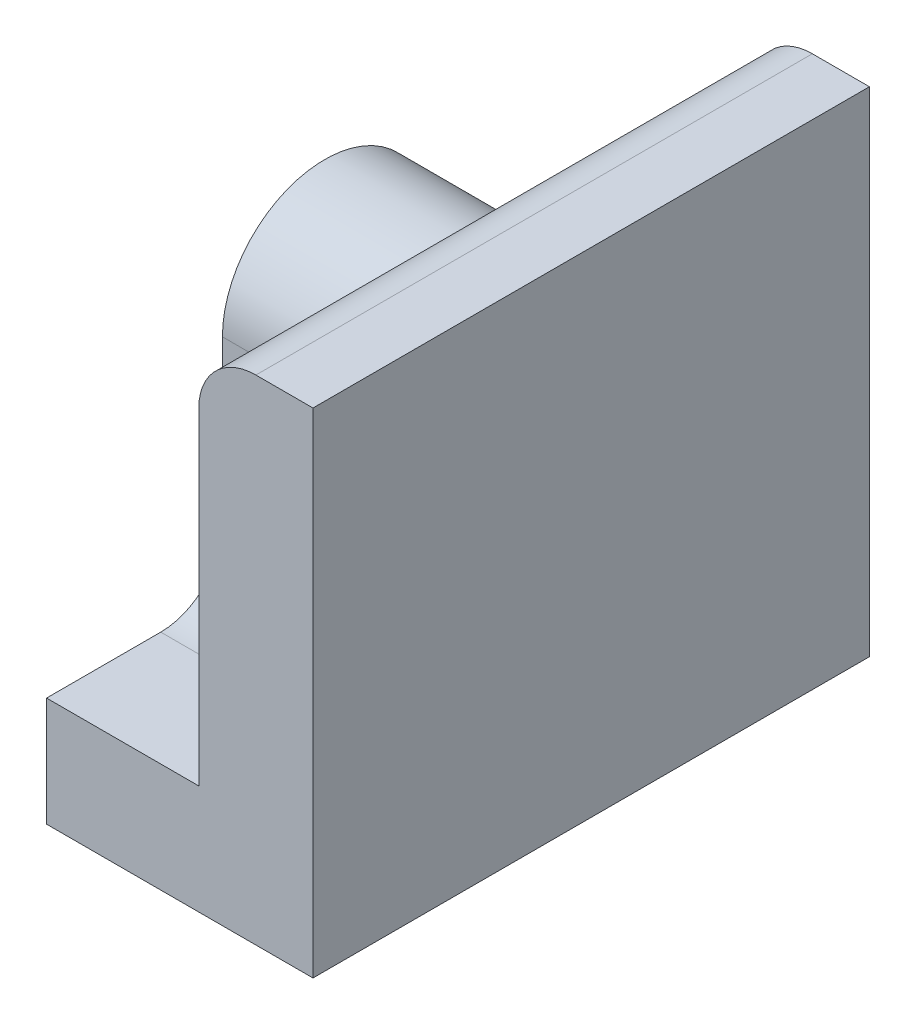
ISO-10303-21;
HEADER;
FILE_DESCRIPTION(('STEP AP214'),'2;1');
FILE_NAME('part.step','',(''),(''),'','','');
FILE_SCHEMA(('AUTOMOTIVE_DESIGN { 1 0 10303 214 1 1 1 1 }'));
ENDSEC;
DATA;
#1=APPLICATION_CONTEXT('core data for automotive mechanical design processes');
#2=APPLICATION_PROTOCOL_DEFINITION('international standard','automotive_design',2000,#1);
#3=PRODUCT_CONTEXT('',#1,'mechanical');
#4=PRODUCT('Part','Part','',(#3));
#5=PRODUCT_RELATED_PRODUCT_CATEGORY('part','',(#4));
#6=PRODUCT_DEFINITION_FORMATION('','',#4);
#7=PRODUCT_DEFINITION_CONTEXT('part definition',#1,'design');
#8=PRODUCT_DEFINITION('design','',#6,#7);
#9=PRODUCT_DEFINITION_SHAPE('','',#8);
#10=(LENGTH_UNIT() NAMED_UNIT(*) SI_UNIT(.MILLI.,.METRE.));
#11=(NAMED_UNIT(*) PLANE_ANGLE_UNIT() SI_UNIT($,.RADIAN.));
#12=(NAMED_UNIT(*) SI_UNIT($,.STERADIAN.) SOLID_ANGLE_UNIT());
#13=UNCERTAINTY_MEASURE_WITH_UNIT(LENGTH_MEASURE(1.E-05),#10,'distance_accuracy_value','');
#14=(GEOMETRIC_REPRESENTATION_CONTEXT(3) GLOBAL_UNCERTAINTY_ASSIGNED_CONTEXT((#13)) GLOBAL_UNIT_ASSIGNED_CONTEXT((#10,
#11,#12)) REPRESENTATION_CONTEXT('',''));
#15=CARTESIAN_POINT('',(0.,0.,0.));
#16=DIRECTION('',(0.,0.,1.));
#17=DIRECTION('',(1.,0.,0.));
#18=AXIS2_PLACEMENT_3D('',#15,#16,#17);
#19=CARTESIAN_POINT('',(-7.,0.,-7.31));
#20=DIRECTION('',(0.,0.,1.));
#21=DIRECTION('',(1.,0.,0.));
#22=AXIS2_PLACEMENT_3D('',#19,#20,#21);
#23=PLANE('',#22);
#24=CARTESIAN_POINT('',(-1.5,8.6,-7.31));
#25=DIRECTION('',(0.,0.,-1.));
#26=DIRECTION('',(-1.,0.,0.));
#27=AXIS2_PLACEMENT_3D('',#24,#25,#26);
#28=CIRCLE('',#27,1.5);
#29=CARTESIAN_POINT('',(-3.,8.6,-7.31));
#30=VERTEX_POINT('',#29);
#31=CARTESIAN_POINT('',(-1.49999999999999,10.1,-7.31));
#32=VERTEX_POINT('',#31);
#33=EDGE_CURVE('E142',#30,#32,#28,.T.);
#34=ORIENTED_EDGE('',*,*,#33,.T.);
#35=DIRECTION('',(1.,0.,0.));
#36=VECTOR('',#35,1.);
#37=CARTESIAN_POINT('',(-3.,10.1,-7.31));
#38=LINE('',#37,#36);
#39=CARTESIAN_POINT('',(0.,10.1,-7.31));
#40=VERTEX_POINT('',#39);
#41=EDGE_CURVE('E150',#32,#40,#38,.T.);
#42=ORIENTED_EDGE('',*,*,#41,.T.);
#43=DIRECTION('',(0.,-1.,0.));
#44=VECTOR('',#43,1.);
#45=CARTESIAN_POINT('',(0.,0.,-7.31));
#46=LINE('',#45,#44);
#47=CARTESIAN_POINT('',(0.,-2.87,-7.31));
#48=VERTEX_POINT('',#47);
#49=EDGE_CURVE('E212',#40,#48,#46,.T.);
#50=ORIENTED_EDGE('',*,*,#49,.T.);
#51=DIRECTION('',(1.,0.,0.));
#52=VECTOR('',#51,1.);
#53=CARTESIAN_POINT('',(-7.,-2.87,-7.31));
#54=LINE('',#53,#52);
#55=CARTESIAN_POINT('',(-7.,-2.87,-7.31));
#56=VERTEX_POINT('',#55);
#57=EDGE_CURVE('E227',#56,#48,#54,.T.);
#58=ORIENTED_EDGE('',*,*,#57,.F.);
#59=DIRECTION('',(0.,-1.,0.));
#60=VECTOR('',#59,1.);
#61=CARTESIAN_POINT('',(-7.,0.,-7.31));
#62=LINE('',#61,#60);
#63=CARTESIAN_POINT('',(-7.,0.,-7.31));
#64=VERTEX_POINT('',#63);
#65=EDGE_CURVE('E219',#64,#56,#62,.T.);
#66=ORIENTED_EDGE('',*,*,#65,.F.);
#67=DIRECTION('',(1.,0.,0.));
#68=VECTOR('',#67,1.);
#69=CARTESIAN_POINT('',(-7.,0.,-7.31));
#70=LINE('',#69,#68);
#71=CARTESIAN_POINT('',(-3.,0.,-7.31));
#72=VERTEX_POINT('',#71);
#73=EDGE_CURVE('E44',#64,#72,#70,.T.);
#74=ORIENTED_EDGE('',*,*,#73,.T.);
#75=DIRECTION('',(0.,1.,0.));
#76=VECTOR('',#75,1.);
#77=CARTESIAN_POINT('',(-3.,0.,-7.31));
#78=LINE('',#77,#76);
#79=EDGE_CURVE('E198',#72,#30,#78,.T.);
#80=ORIENTED_EDGE('',*,*,#79,.T.);
#81=EDGE_LOOP('',(#34,#42,#50,#58,#66,#74,#80));
#82=FACE_BOUND('',#81,.T.);
#83=ADVANCED_FACE('F35',(#82),#23,.F.);
#84=CARTESIAN_POINT('',(-3.,10.1,0.));
#85=DIRECTION('',(0.,-1.,0.));
#86=DIRECTION('',(0.,0.,-1.));
#87=AXIS2_PLACEMENT_3D('',#84,#85,#86);
#88=PLANE('',#87);
#89=DIRECTION('',(0.,0.,-1.));
#90=VECTOR('',#89,1.);
#91=CARTESIAN_POINT('',(-1.49999999999999,10.1,7.311));
#92=LINE('',#91,#90);
#93=CARTESIAN_POINT('',(-1.49999999999999,10.1,7.31));
#94=VERTEX_POINT('',#93);
#95=EDGE_CURVE('E136',#94,#32,#92,.T.);
#96=ORIENTED_EDGE('',*,*,#95,.F.);
#97=DIRECTION('',(1.,0.,0.));
#98=VECTOR('',#97,1.);
#99=CARTESIAN_POINT('',(-3.,10.1,7.31));
#100=LINE('',#99,#98);
#101=CARTESIAN_POINT('',(0.,10.1,7.31));
#102=VERTEX_POINT('',#101);
#103=EDGE_CURVE('E148',#94,#102,#100,.T.);
#104=ORIENTED_EDGE('',*,*,#103,.T.);
#105=DIRECTION('',(0.,0.,-1.));
#106=VECTOR('',#105,1.);
#107=CARTESIAN_POINT('',(0.,10.1,0.));
#108=LINE('',#107,#106);
#109=EDGE_CURVE('E181',#102,#40,#108,.T.);
#110=ORIENTED_EDGE('',*,*,#109,.T.);
#111=ORIENTED_EDGE('',*,*,#41,.F.);
#112=EDGE_LOOP('',(#96,#104,#110,#111));
#113=FACE_BOUND('',#112,.T.);
#114=ADVANCED_FACE('F146',(#113),#88,.F.);
#115=CARTESIAN_POINT('',(-3.,0.,0.));
#116=DIRECTION('',(1.,0.,0.));
#117=DIRECTION('',(0.,0.,-1.));
#118=AXIS2_PLACEMENT_3D('',#115,#116,#117);
#119=PLANE('',#118);
#120=DIRECTION('',(0.,1.,0.));
#121=VECTOR('',#120,1.);
#122=CARTESIAN_POINT('',(-3.,0.,7.31));
#123=LINE('',#122,#121);
#124=CARTESIAN_POINT('',(-3.,0.,7.31));
#125=VERTEX_POINT('',#124);
#126=CARTESIAN_POINT('',(-3.,8.6,7.31));
#127=VERTEX_POINT('',#126);
#128=EDGE_CURVE('E290',#125,#127,#123,.T.);
#129=ORIENTED_EDGE('',*,*,#128,.T.);
#130=DIRECTION('',(0.,0.,-1.));
#131=VECTOR('',#130,1.);
#132=CARTESIAN_POINT('',(-3.,8.6,7.311));
#133=LINE('',#132,#131);
#134=CARTESIAN_POINT('',(-3.,8.6,0.));
#135=VERTEX_POINT('',#134);
#136=EDGE_CURVE('E52',#127,#135,#133,.T.);
#137=ORIENTED_EDGE('',*,*,#136,.T.);
#138=CARTESIAN_POINT('',(-3.,5.91,0.));
#139=DIRECTION('',(1.,0.,0.));
#140=DIRECTION('',(0.,0.,-1.));
#141=AXIS2_PLACEMENT_3D('',#138,#139,#140);
#142=CIRCLE('',#141,2.69);
#143=CARTESIAN_POINT('',(-3.,5.91,2.69));
#144=VERTEX_POINT('',#143);
#145=EDGE_CURVE('E201',#135,#144,#142,.T.);
#146=ORIENTED_EDGE('',*,*,#145,.T.);
#147=DIRECTION('',(0.,1.,0.));
#148=VECTOR('',#147,1.);
#149=CARTESIAN_POINT('',(-3.,0.,2.69));
#150=LINE('',#149,#148);
#151=CARTESIAN_POINT('',(-3.,1.62,2.69));
#152=VERTEX_POINT('',#151);
#153=EDGE_CURVE('E151',#152,#144,#150,.T.);
#154=ORIENTED_EDGE('',*,*,#153,.F.);
#155=CARTESIAN_POINT('',(-3.,1.62,4.31));
#156=DIRECTION('',(-1.,0.,0.));
#157=DIRECTION('',(0.,0.,1.));
#158=AXIS2_PLACEMENT_3D('',#155,#156,#157);
#159=CIRCLE('',#158,1.62);
#160=CARTESIAN_POINT('',(-3.,0.,4.31));
#161=VERTEX_POINT('',#160);
#162=EDGE_CURVE('E158',#152,#161,#159,.T.);
#163=ORIENTED_EDGE('',*,*,#162,.T.);
#164=DIRECTION('',(0.,0.,1.));
#165=VECTOR('',#164,1.);
#166=CARTESIAN_POINT('',(-3.,0.,0.));
#167=LINE('',#166,#165);
#168=EDGE_CURVE('E162',#161,#125,#167,.T.);
#169=ORIENTED_EDGE('',*,*,#168,.T.);
#170=EDGE_LOOP('',(#129,#137,#146,#154,#163,#169));
#171=FACE_BOUND('',#170,.T.);
#172=ADVANCED_FACE('F267',(#171),#119,.F.);
#173=CARTESIAN_POINT('',(-7.,0.,7.31));
#174=DIRECTION('',(0.,0.,1.));
#175=DIRECTION('',(1.,0.,0.));
#176=AXIS2_PLACEMENT_3D('',#173,#174,#175);
#177=PLANE('',#176);
#178=ORIENTED_EDGE('',*,*,#103,.F.);
#179=CARTESIAN_POINT('',(-1.5,8.6,7.31));
#180=DIRECTION('',(0.,0.,1.));
#181=DIRECTION('',(1.,0.,0.));
#182=AXIS2_PLACEMENT_3D('',#179,#180,#181);
#183=CIRCLE('',#182,1.5);
#184=EDGE_CURVE('E133',#127,#94,#183,.F.);
#185=ORIENTED_EDGE('',*,*,#184,.F.);
#186=ORIENTED_EDGE('',*,*,#128,.F.);
#187=DIRECTION('',(1.,0.,0.));
#188=VECTOR('',#187,1.);
#189=CARTESIAN_POINT('',(-7.,0.,7.31));
#190=LINE('',#189,#188);
#191=CARTESIAN_POINT('',(-7.,0.,7.31));
#192=VERTEX_POINT('',#191);
#193=EDGE_CURVE('E187',#192,#125,#190,.T.);
#194=ORIENTED_EDGE('',*,*,#193,.F.);
#195=DIRECTION('',(0.,-1.,0.));
#196=VECTOR('',#195,1.);
#197=CARTESIAN_POINT('',(-7.,0.,7.31));
#198=LINE('',#197,#196);
#199=CARTESIAN_POINT('',(-7.,-2.87,7.31));
#200=VERTEX_POINT('',#199);
#201=EDGE_CURVE('E171',#192,#200,#198,.T.);
#202=ORIENTED_EDGE('',*,*,#201,.T.);
#203=DIRECTION('',(1.,0.,0.));
#204=VECTOR('',#203,1.);
#205=CARTESIAN_POINT('',(-7.,-2.87,7.31));
#206=LINE('',#205,#204);
#207=CARTESIAN_POINT('',(0.,-2.87,7.31));
#208=VERTEX_POINT('',#207);
#209=EDGE_CURVE('E185',#200,#208,#206,.T.);
#210=ORIENTED_EDGE('',*,*,#209,.T.);
#211=DIRECTION('',(0.,-1.,0.));
#212=VECTOR('',#211,1.);
#213=CARTESIAN_POINT('',(0.,0.,7.31));
#214=LINE('',#213,#212);
#215=EDGE_CURVE('E157',#102,#208,#214,.T.);
#216=ORIENTED_EDGE('',*,*,#215,.F.);
#217=EDGE_LOOP('',(#178,#185,#186,#194,#202,#210,#216));
#218=FACE_BOUND('',#217,.T.);
#219=ADVANCED_FACE('F154',(#218),#177,.T.);
#220=CARTESIAN_POINT('',(-7.,5.91,0.));
#221=DIRECTION('',(1.,0.,0.));
#222=DIRECTION('',(0.,0.,-1.));
#223=AXIS2_PLACEMENT_3D('',#220,#221,#222);
#224=CYLINDRICAL_SURFACE('',#223,2.69);
#225=DIRECTION('',(1.,0.,0.));
#226=VECTOR('',#225,1.);
#227=CARTESIAN_POINT('',(-7.,5.91,2.69));
#228=LINE('',#227,#226);
#229=CARTESIAN_POINT('',(-7.,5.91,2.69));
#230=VERTEX_POINT('',#229);
#231=EDGE_CURVE('E182',#230,#144,#228,.T.);
#232=ORIENTED_EDGE('',*,*,#231,.T.);
#233=ORIENTED_EDGE('',*,*,#145,.F.);
#234=CARTESIAN_POINT('',(-3.,5.91,-2.69));
#235=VERTEX_POINT('',#234);
#236=EDGE_CURVE('E202',#235,#135,#142,.T.);
#237=ORIENTED_EDGE('',*,*,#236,.F.);
#238=DIRECTION('',(1.,0.,0.));
#239=VECTOR('',#238,1.);
#240=CARTESIAN_POINT('',(-7.,5.91,-2.69));
#241=LINE('',#240,#239);
#242=CARTESIAN_POINT('',(-7.,5.91,-2.69));
#243=VERTEX_POINT('',#242);
#244=EDGE_CURVE('E229',#243,#235,#241,.T.);
#245=ORIENTED_EDGE('',*,*,#244,.F.);
#246=CARTESIAN_POINT('',(-7.,5.91,0.));
#247=DIRECTION('',(1.,0.,0.));
#248=DIRECTION('',(0.,0.,-1.));
#249=AXIS2_PLACEMENT_3D('',#246,#247,#248);
#250=CIRCLE('',#249,2.69);
#251=EDGE_CURVE('E215',#243,#230,#250,.T.);
#252=ORIENTED_EDGE('',*,*,#251,.T.);
#253=EDGE_LOOP('',(#232,#233,#237,#245,#252));
#254=FACE_BOUND('',#253,.T.);
#255=ADVANCED_FACE('F270',(#254),#224,.T.);
#256=CARTESIAN_POINT('',(-7.,1.62,4.31));
#257=DIRECTION('',(1.,0.,0.));
#258=DIRECTION('',(0.,0.,-1.));
#259=AXIS2_PLACEMENT_3D('',#256,#257,#258);
#260=CYLINDRICAL_SURFACE('',#259,1.62);
#261=DIRECTION('',(1.,0.,0.));
#262=VECTOR('',#261,1.);
#263=CARTESIAN_POINT('',(-7.,0.,4.31));
#264=LINE('',#263,#262);
#265=CARTESIAN_POINT('',(-7.,0.,4.31));
#266=VERTEX_POINT('',#265);
#267=EDGE_CURVE('E176',#266,#161,#264,.T.);
#268=ORIENTED_EDGE('',*,*,#267,.T.);
#269=ORIENTED_EDGE('',*,*,#162,.F.);
#270=DIRECTION('',(1.,0.,0.));
#271=VECTOR('',#270,1.);
#272=CARTESIAN_POINT('',(-7.,1.62,2.69));
#273=LINE('',#272,#271);
#274=CARTESIAN_POINT('',(-7.,1.62,2.69));
#275=VERTEX_POINT('',#274);
#276=EDGE_CURVE('E178',#275,#152,#273,.T.);
#277=ORIENTED_EDGE('',*,*,#276,.F.);
#278=CARTESIAN_POINT('',(-7.,1.62,4.31));
#279=DIRECTION('',(-1.,0.,0.));
#280=DIRECTION('',(0.,0.,1.));
#281=AXIS2_PLACEMENT_3D('',#278,#279,#280);
#282=CIRCLE('',#281,1.62);
#283=EDGE_CURVE('E160',#275,#266,#282,.T.);
#284=ORIENTED_EDGE('',*,*,#283,.T.);
#285=EDGE_LOOP('',(#268,#269,#277,#284));
#286=FACE_BOUND('',#285,.T.);
#287=ADVANCED_FACE('F272',(#286),#260,.F.);
#288=CARTESIAN_POINT('',(-7.,0.,2.69));
#289=DIRECTION('',(0.,0.,-1.));
#290=DIRECTION('',(-1.,0.,0.));
#291=AXIS2_PLACEMENT_3D('',#288,#289,#290);
#292=PLANE('',#291);
#293=ORIENTED_EDGE('',*,*,#153,.T.);
#294=ORIENTED_EDGE('',*,*,#231,.F.);
#295=DIRECTION('',(0.,1.,0.));
#296=VECTOR('',#295,1.);
#297=CARTESIAN_POINT('',(-7.,0.,2.69));
#298=LINE('',#297,#296);
#299=EDGE_CURVE('E174',#275,#230,#298,.T.);
#300=ORIENTED_EDGE('',*,*,#299,.F.);
#301=ORIENTED_EDGE('',*,*,#276,.T.);
#302=EDGE_LOOP('',(#293,#294,#300,#301));
#303=FACE_BOUND('',#302,.T.);
#304=ADVANCED_FACE('F278',(#303),#292,.F.);
#305=CARTESIAN_POINT('',(-7.,0.,0.));
#306=DIRECTION('',(0.,1.,0.));
#307=DIRECTION('',(0.,0.,1.));
#308=AXIS2_PLACEMENT_3D('',#305,#306,#307);
#309=PLANE('',#308);
#310=ORIENTED_EDGE('',*,*,#193,.T.);
#311=ORIENTED_EDGE('',*,*,#168,.F.);
#312=ORIENTED_EDGE('',*,*,#267,.F.);
#313=DIRECTION('',(0.,0.,1.));
#314=VECTOR('',#313,1.);
#315=CARTESIAN_POINT('',(-7.,0.,0.));
#316=LINE('',#315,#314);
#317=EDGE_CURVE('E168',#266,#192,#316,.T.);
#318=ORIENTED_EDGE('',*,*,#317,.T.);
#319=EDGE_LOOP('',(#310,#311,#312,#318));
#320=FACE_BOUND('',#319,.T.);
#321=ADVANCED_FACE('F296',(#320),#309,.T.);
#322=CARTESIAN_POINT('',(-7.,1.62,-4.31));
#323=DIRECTION('',(1.,0.,0.));
#324=DIRECTION('',(0.,0.,-1.));
#325=AXIS2_PLACEMENT_3D('',#322,#323,#324);
#326=CYLINDRICAL_SURFACE('',#325,1.62);
#327=CARTESIAN_POINT('',(-3.,1.62,-4.31));
#328=DIRECTION('',(1.,0.,0.));
#329=DIRECTION('',(0.,0.,-1.));
#330=AXIS2_PLACEMENT_3D('',#327,#328,#329);
#331=CIRCLE('',#330,1.62);
#332=CARTESIAN_POINT('',(-3.,1.62,-2.69));
#333=VERTEX_POINT('',#332);
#334=CARTESIAN_POINT('',(-3.,0.,-4.31));
#335=VERTEX_POINT('',#334);
#336=EDGE_CURVE('E60',#333,#335,#331,.T.);
#337=ORIENTED_EDGE('',*,*,#336,.T.);
#338=DIRECTION('',(1.,0.,0.));
#339=VECTOR('',#338,1.);
#340=CARTESIAN_POINT('',(-7.,0.,-4.31));
#341=LINE('',#340,#339);
#342=CARTESIAN_POINT('',(-7.,0.,-4.31));
#343=VERTEX_POINT('',#342);
#344=EDGE_CURVE('E11',#343,#335,#341,.T.);
#345=ORIENTED_EDGE('',*,*,#344,.F.);
#346=CARTESIAN_POINT('',(-7.,1.62,-4.31));
#347=DIRECTION('',(1.,0.,0.));
#348=DIRECTION('',(0.,0.,-1.));
#349=AXIS2_PLACEMENT_3D('',#346,#347,#348);
#350=CIRCLE('',#349,1.62);
#351=CARTESIAN_POINT('',(-7.,1.62,-2.69));
#352=VERTEX_POINT('',#351);
#353=EDGE_CURVE('E208',#352,#343,#350,.T.);
#354=ORIENTED_EDGE('',*,*,#353,.F.);
#355=DIRECTION('',(1.,0.,0.));
#356=VECTOR('',#355,1.);
#357=CARTESIAN_POINT('',(-7.,1.62,-2.69));
#358=LINE('',#357,#356);
#359=EDGE_CURVE('E39',#352,#333,#358,.T.);
#360=ORIENTED_EDGE('',*,*,#359,.T.);
#361=EDGE_LOOP('',(#337,#345,#354,#360));
#362=FACE_BOUND('',#361,.T.);
#363=ADVANCED_FACE('F37',(#362),#326,.F.);
#364=CARTESIAN_POINT('',(-7.,0.,0.));
#365=DIRECTION('',(0.,-1.,0.));
#366=DIRECTION('',(0.,0.,-1.));
#367=AXIS2_PLACEMENT_3D('',#364,#365,#366);
#368=PLANE('',#367);
#369=DIRECTION('',(0.,0.,-1.));
#370=VECTOR('',#369,1.);
#371=CARTESIAN_POINT('',(-3.,0.,0.));
#372=LINE('',#371,#370);
#373=EDGE_CURVE('E196',#335,#72,#372,.T.);
#374=ORIENTED_EDGE('',*,*,#373,.T.);
#375=ORIENTED_EDGE('',*,*,#73,.F.);
#376=DIRECTION('',(0.,0.,-1.));
#377=VECTOR('',#376,1.);
#378=CARTESIAN_POINT('',(-7.,0.,0.));
#379=LINE('',#378,#377);
#380=EDGE_CURVE('E221',#343,#64,#379,.T.);
#381=ORIENTED_EDGE('',*,*,#380,.F.);
#382=ORIENTED_EDGE('',*,*,#344,.T.);
#383=EDGE_LOOP('',(#374,#375,#381,#382));
#384=FACE_BOUND('',#383,.T.);
#385=ADVANCED_FACE('F241',(#384),#368,.F.);
#386=CARTESIAN_POINT('',(-7.,0.,-2.69));
#387=DIRECTION('',(0.,0.,-1.));
#388=DIRECTION('',(-1.,0.,0.));
#389=AXIS2_PLACEMENT_3D('',#386,#387,#388);
#390=PLANE('',#389);
#391=ORIENTED_EDGE('',*,*,#244,.T.);
#392=DIRECTION('',(0.,1.,0.));
#393=VECTOR('',#392,1.);
#394=CARTESIAN_POINT('',(-3.,0.,-2.69));
#395=LINE('',#394,#393);
#396=EDGE_CURVE('E192',#333,#235,#395,.T.);
#397=ORIENTED_EDGE('',*,*,#396,.F.);
#398=ORIENTED_EDGE('',*,*,#359,.F.);
#399=DIRECTION('',(0.,1.,0.));
#400=VECTOR('',#399,1.);
#401=CARTESIAN_POINT('',(-7.,0.,-2.69));
#402=LINE('',#401,#400);
#403=EDGE_CURVE('E211',#352,#243,#402,.T.);
#404=ORIENTED_EDGE('',*,*,#403,.T.);
#405=EDGE_LOOP('',(#391,#397,#398,#404));
#406=FACE_BOUND('',#405,.T.);
#407=ADVANCED_FACE('F251',(#406),#390,.T.);
#408=CARTESIAN_POINT('',(-7.,-2.87,0.));
#409=DIRECTION('',(0.,1.,0.));
#410=DIRECTION('',(0.,0.,1.));
#411=AXIS2_PLACEMENT_3D('',#408,#409,#410);
#412=PLANE('',#411);
#413=DIRECTION('',(0.,0.,1.));
#414=VECTOR('',#413,1.);
#415=CARTESIAN_POINT('',(0.,-2.87,0.));
#416=LINE('',#415,#414);
#417=EDGE_CURVE('E207',#48,#208,#416,.T.);
#418=ORIENTED_EDGE('',*,*,#417,.T.);
#419=ORIENTED_EDGE('',*,*,#209,.F.);
#420=DIRECTION('',(0.,0.,1.));
#421=VECTOR('',#420,1.);
#422=CARTESIAN_POINT('',(-7.,-2.87,0.));
#423=LINE('',#422,#421);
#424=EDGE_CURVE('E217',#56,#200,#423,.T.);
#425=ORIENTED_EDGE('',*,*,#424,.F.);
#426=ORIENTED_EDGE('',*,*,#57,.T.);
#427=EDGE_LOOP('',(#418,#419,#425,#426));
#428=FACE_BOUND('',#427,.T.);
#429=ADVANCED_FACE('F253',(#428),#412,.F.);
#430=CARTESIAN_POINT('',(-7.,0.,0.));
#431=DIRECTION('',(1.,0.,0.));
#432=DIRECTION('',(0.,0.,-1.));
#433=AXIS2_PLACEMENT_3D('',#430,#431,#432);
#434=PLANE('',#433);
#435=ORIENTED_EDGE('',*,*,#353,.T.);
#436=ORIENTED_EDGE('',*,*,#380,.T.);
#437=ORIENTED_EDGE('',*,*,#65,.T.);
#438=ORIENTED_EDGE('',*,*,#424,.T.);
#439=ORIENTED_EDGE('',*,*,#201,.F.);
#440=ORIENTED_EDGE('',*,*,#317,.F.);
#441=ORIENTED_EDGE('',*,*,#283,.F.);
#442=ORIENTED_EDGE('',*,*,#299,.T.);
#443=ORIENTED_EDGE('',*,*,#251,.F.);
#444=ORIENTED_EDGE('',*,*,#403,.F.);
#445=EDGE_LOOP('',(#435,#436,#437,#438,#439,#440,#441,#442,#443,#444));
#446=FACE_BOUND('',#445,.T.);
#447=ADVANCED_FACE('F247',(#446),#434,.F.);
#448=CARTESIAN_POINT('',(0.,0.,0.));
#449=DIRECTION('',(1.,0.,0.));
#450=DIRECTION('',(0.,0.,-1.));
#451=AXIS2_PLACEMENT_3D('',#448,#449,#450);
#452=PLANE('',#451);
#453=ORIENTED_EDGE('',*,*,#109,.F.);
#454=ORIENTED_EDGE('',*,*,#215,.T.);
#455=ORIENTED_EDGE('',*,*,#417,.F.);
#456=ORIENTED_EDGE('',*,*,#49,.F.);
#457=EDGE_LOOP('',(#453,#454,#455,#456));
#458=FACE_BOUND('',#457,.T.);
#459=ADVANCED_FACE('F300',(#458),#452,.T.);
#460=ORIENTED_EDGE('',*,*,#236,.T.);
#461=EDGE_CURVE('E302',#135,#30,#133,.T.);
#462=ORIENTED_EDGE('',*,*,#461,.T.);
#463=ORIENTED_EDGE('',*,*,#79,.F.);
#464=ORIENTED_EDGE('',*,*,#373,.F.);
#465=ORIENTED_EDGE('',*,*,#336,.F.);
#466=ORIENTED_EDGE('',*,*,#396,.T.);
#467=EDGE_LOOP('',(#460,#462,#463,#464,#465,#466));
#468=FACE_BOUND('',#467,.T.);
#469=ADVANCED_FACE('F236',(#468),#119,.F.);
#470=CARTESIAN_POINT('',(-1.5,8.6,7.311));
#471=DIRECTION('',(0.,0.,-1.));
#472=DIRECTION('',(-1.,0.,0.));
#473=AXIS2_PLACEMENT_3D('',#470,#471,#472);
#474=CYLINDRICAL_SURFACE('',#473,1.5);
#475=ORIENTED_EDGE('',*,*,#184,.T.);
#476=ORIENTED_EDGE('',*,*,#95,.T.);
#477=ORIENTED_EDGE('',*,*,#33,.F.);
#478=ORIENTED_EDGE('',*,*,#461,.F.);
#479=ORIENTED_EDGE('',*,*,#136,.F.);
#480=EDGE_LOOP('',(#475,#476,#477,#478,#479));
#481=FACE_BOUND('',#480,.T.);
#482=ADVANCED_FACE('F135',(#481),#474,.T.);
#483=CLOSED_SHELL('',(#83,#114,#172,#219,#255,#287,#304,#321,#363,#385,#407,#429,#447,#459,#469,#482));
#484=MANIFOLD_SOLID_BREP('B2',#483);
#485=ADVANCED_BREP_SHAPE_REPRESENTATION('',(#18,#484),#14);
#486=SHAPE_DEFINITION_REPRESENTATION(#9,#485);
ENDSEC;
END-ISO-10303-21;
